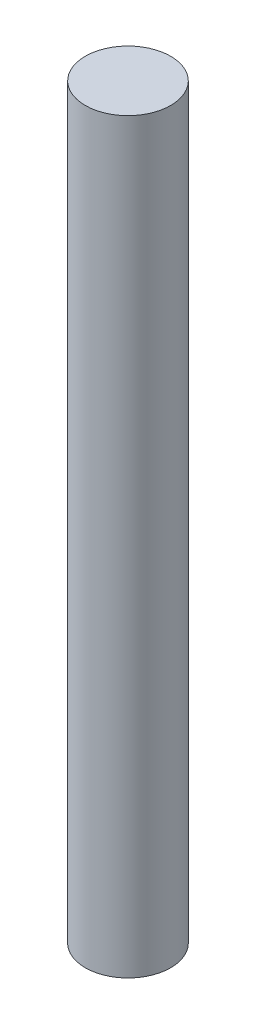
ISO-10303-21;
HEADER;
FILE_DESCRIPTION(('STEP AP214'),'2;1');
FILE_NAME('part.step','',(''),(''),'','','');
FILE_SCHEMA(('AUTOMOTIVE_DESIGN { 1 0 10303 214 1 1 1 1 }'));
ENDSEC;
DATA;
#1=APPLICATION_CONTEXT('core data for automotive mechanical design processes');
#2=APPLICATION_PROTOCOL_DEFINITION('international standard','automotive_design',2000,#1);
#3=PRODUCT_CONTEXT('',#1,'mechanical');
#4=PRODUCT('Part','Part','',(#3));
#5=PRODUCT_RELATED_PRODUCT_CATEGORY('part','',(#4));
#6=PRODUCT_DEFINITION_FORMATION('','',#4);
#7=PRODUCT_DEFINITION_CONTEXT('part definition',#1,'design');
#8=PRODUCT_DEFINITION('design','',#6,#7);
#9=PRODUCT_DEFINITION_SHAPE('','',#8);
#10=(LENGTH_UNIT() NAMED_UNIT(*) SI_UNIT(.MILLI.,.METRE.));
#11=(NAMED_UNIT(*) PLANE_ANGLE_UNIT() SI_UNIT($,.RADIAN.));
#12=(NAMED_UNIT(*) SI_UNIT($,.STERADIAN.) SOLID_ANGLE_UNIT());
#13=UNCERTAINTY_MEASURE_WITH_UNIT(LENGTH_MEASURE(1.E-05),#10,'distance_accuracy_value','');
#14=(GEOMETRIC_REPRESENTATION_CONTEXT(3) GLOBAL_UNCERTAINTY_ASSIGNED_CONTEXT((#13)) GLOBAL_UNIT_ASSIGNED_CONTEXT((#10,
#11,#12)) REPRESENTATION_CONTEXT('',''));
#15=CARTESIAN_POINT('',(0.,0.,0.));
#16=DIRECTION('',(0.,0.,1.));
#17=DIRECTION('',(1.,0.,0.));
#18=AXIS2_PLACEMENT_3D('',#15,#16,#17);
#19=CARTESIAN_POINT('',(0.,17.5,0.));
#20=DIRECTION('',(0.,-1.,0.));
#21=DIRECTION('',(0.,0.,-1.));
#22=AXIS2_PLACEMENT_3D('',#19,#20,#21);
#23=CYLINDRICAL_SURFACE('',#22,1.);
#24=CARTESIAN_POINT('',(0.,17.5,0.));
#25=DIRECTION('',(0.,1.,0.));
#26=DIRECTION('',(0.,0.,1.));
#27=AXIS2_PLACEMENT_3D('',#24,#25,#26);
#28=CIRCLE('',#27,1.);
#29=CARTESIAN_POINT('',(0.,17.5,1.));
#30=VERTEX_POINT('',#29);
#31=EDGE_CURVE('E10',#30,#30,#28,.T.);
#32=ORIENTED_EDGE('',*,*,#31,.F.);
#33=EDGE_LOOP('',(#32));
#34=FACE_BOUND('',#33,.T.);
#35=CARTESIAN_POINT('',(0.,0.,0.));
#36=DIRECTION('',(0.,1.,0.));
#37=DIRECTION('',(0.,0.,1.));
#38=AXIS2_PLACEMENT_3D('',#35,#36,#37);
#39=CIRCLE('',#38,1.);
#40=CARTESIAN_POINT('',(0.,0.,1.));
#41=VERTEX_POINT('',#40);
#42=EDGE_CURVE('E40',#41,#41,#39,.T.);
#43=ORIENTED_EDGE('',*,*,#42,.T.);
#44=EDGE_LOOP('',(#43));
#45=FACE_BOUND('',#44,.T.);
#46=ADVANCED_FACE('F37',(#34,#45),#23,.T.);
#47=CARTESIAN_POINT('',(0.,17.5,0.));
#48=DIRECTION('',(0.,1.,0.));
#49=DIRECTION('',(0.,0.,1.));
#50=AXIS2_PLACEMENT_3D('',#47,#48,#49);
#51=PLANE('',#50);
#52=ORIENTED_EDGE('',*,*,#31,.T.);
#53=EDGE_LOOP('',(#52));
#54=FACE_BOUND('',#53,.T.);
#55=ADVANCED_FACE('F52',(#54),#51,.T.);
#56=CARTESIAN_POINT('',(0.,0.,0.));
#57=DIRECTION('',(0.,1.,0.));
#58=DIRECTION('',(0.,0.,1.));
#59=AXIS2_PLACEMENT_3D('',#56,#57,#58);
#60=PLANE('',#59);
#61=ORIENTED_EDGE('',*,*,#42,.F.);
#62=EDGE_LOOP('',(#61));
#63=FACE_BOUND('',#62,.T.);
#64=ADVANCED_FACE('F50',(#63),#60,.F.);
#65=CLOSED_SHELL('',(#46,#55,#64));
#66=MANIFOLD_SOLID_BREP('B2',#65);
#67=ADVANCED_BREP_SHAPE_REPRESENTATION('',(#18,#66),#14);
#68=SHAPE_DEFINITION_REPRESENTATION(#9,#67);
ENDSEC;
END-ISO-10303-21;
